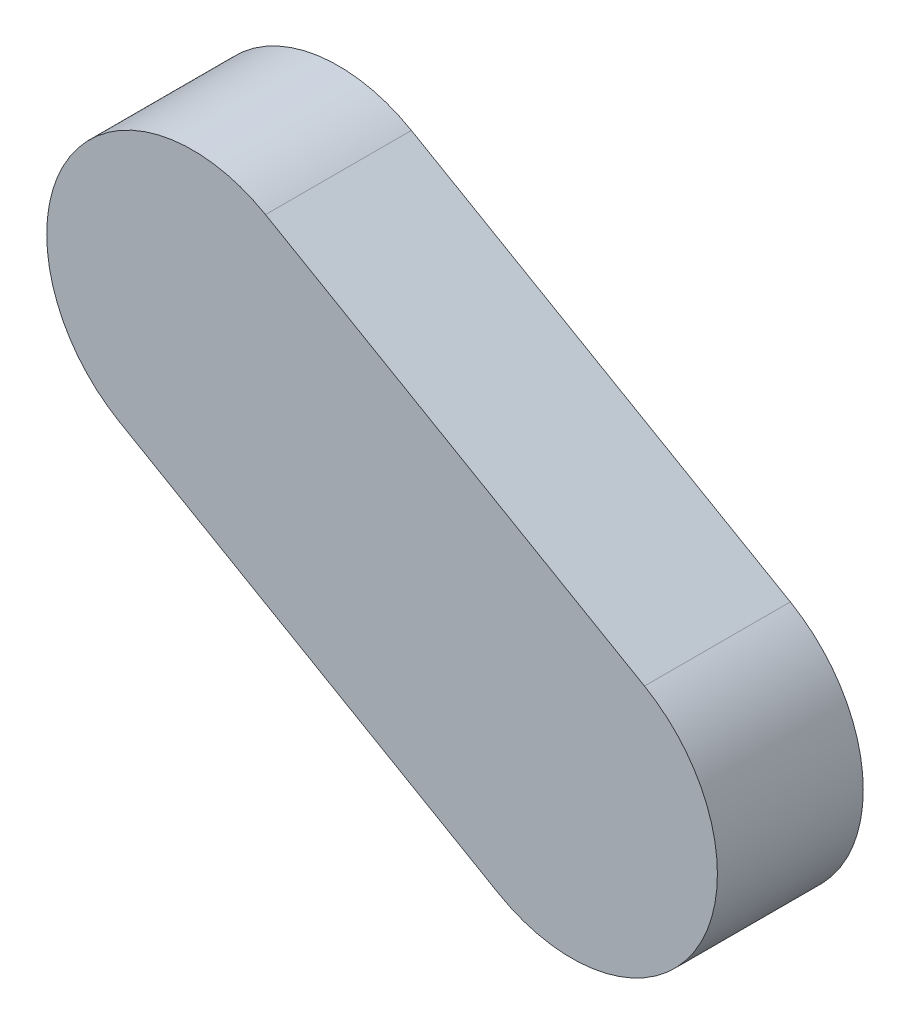
ISO-10303-21;
HEADER;
FILE_DESCRIPTION(('STEP AP214'),'2;1');
FILE_NAME('part.step','',(''),(''),'','','');
FILE_SCHEMA(('AUTOMOTIVE_DESIGN { 1 0 10303 214 1 1 1 1 }'));
ENDSEC;
DATA;
#1=APPLICATION_CONTEXT('core data for automotive mechanical design processes');
#2=APPLICATION_PROTOCOL_DEFINITION('international standard','automotive_design',2000,#1);
#3=PRODUCT_CONTEXT('',#1,'mechanical');
#4=PRODUCT('Part','Part','',(#3));
#5=PRODUCT_RELATED_PRODUCT_CATEGORY('part','',(#4));
#6=PRODUCT_DEFINITION_FORMATION('','',#4);
#7=PRODUCT_DEFINITION_CONTEXT('part definition',#1,'design');
#8=PRODUCT_DEFINITION('design','',#6,#7);
#9=PRODUCT_DEFINITION_SHAPE('','',#8);
#10=(LENGTH_UNIT() NAMED_UNIT(*) SI_UNIT(.MILLI.,.METRE.));
#11=(NAMED_UNIT(*) PLANE_ANGLE_UNIT() SI_UNIT($,.RADIAN.));
#12=(NAMED_UNIT(*) SI_UNIT($,.STERADIAN.) SOLID_ANGLE_UNIT());
#13=UNCERTAINTY_MEASURE_WITH_UNIT(LENGTH_MEASURE(1.E-05),#10,'distance_accuracy_value','');
#14=(GEOMETRIC_REPRESENTATION_CONTEXT(3) GLOBAL_UNCERTAINTY_ASSIGNED_CONTEXT((#13)) GLOBAL_UNIT_ASSIGNED_CONTEXT((#10,
#11,#12)) REPRESENTATION_CONTEXT('',''));
#15=CARTESIAN_POINT('',(0.,0.,0.));
#16=DIRECTION('',(0.,0.,1.));
#17=DIRECTION('',(1.,0.,0.));
#18=AXIS2_PLACEMENT_3D('',#15,#16,#17);
#19=CARTESIAN_POINT('',(-25.9807621135332,14.9999999999998,10.));
#20=DIRECTION('',(0.,0.,-1.));
#21=DIRECTION('',(-1.,0.,0.));
#22=AXIS2_PLACEMENT_3D('',#19,#20,#21);
#23=CYLINDRICAL_SURFACE('',#22,10.0000000000002);
#24=CARTESIAN_POINT('',(-25.9807621135332,14.9999999999998,0.));
#25=DIRECTION('',(0.,0.,1.));
#26=DIRECTION('',(1.,0.,0.));
#27=AXIS2_PLACEMENT_3D('',#24,#25,#26);
#28=CIRCLE('',#27,10.0000000000002);
#29=CARTESIAN_POINT('',(-20.9807621135333,23.6602540378443,0.));
#30=VERTEX_POINT('',#29);
#31=CARTESIAN_POINT('',(-30.9807621135334,6.3397459621551,0.));
#32=VERTEX_POINT('',#31);
#33=EDGE_CURVE('E102',#30,#32,#28,.T.);
#34=ORIENTED_EDGE('',*,*,#33,.T.);
#35=DIRECTION('',(0.,0.,-1.));
#36=VECTOR('',#35,1.);
#37=CARTESIAN_POINT('',(-30.9807621135334,6.3397459621551,10.));
#38=LINE('',#37,#36);
#39=CARTESIAN_POINT('',(-30.9807621135334,6.3397459621551,10.));
#40=VERTEX_POINT('',#39);
#41=EDGE_CURVE('E11',#40,#32,#38,.T.);
#42=ORIENTED_EDGE('',*,*,#41,.F.);
#43=CARTESIAN_POINT('',(-25.9807621135332,14.9999999999998,10.));
#44=DIRECTION('',(0.,0.,1.));
#45=DIRECTION('',(1.,0.,0.));
#46=AXIS2_PLACEMENT_3D('',#43,#44,#45);
#47=CIRCLE('',#46,10.0000000000002);
#48=CARTESIAN_POINT('',(-20.9807621135333,23.6602540378443,10.));
#49=VERTEX_POINT('',#48);
#50=EDGE_CURVE('E90',#49,#40,#47,.T.);
#51=ORIENTED_EDGE('',*,*,#50,.F.);
#52=DIRECTION('',(0.,0.,-1.));
#53=VECTOR('',#52,1.);
#54=CARTESIAN_POINT('',(-20.9807621135333,23.6602540378443,10.));
#55=LINE('',#54,#53);
#56=EDGE_CURVE('E98',#49,#30,#55,.T.);
#57=ORIENTED_EDGE('',*,*,#56,.T.);
#58=EDGE_LOOP('',(#34,#42,#51,#57));
#59=FACE_BOUND('',#58,.T.);
#60=ADVANCED_FACE('F39',(#59),#23,.T.);
#61=CARTESIAN_POINT('',(-30.9807621135334,6.3397459621551,10.));
#62=DIRECTION('',(0.499999999999995,0.866025403784442,0.));
#63=DIRECTION('',(-0.866025403784442,0.499999999999995,0.));
#64=AXIS2_PLACEMENT_3D('',#61,#62,#63);
#65=PLANE('',#64);
#66=DIRECTION('',(0.866025403784442,-0.499999999999995,0.));
#67=VECTOR('',#66,1.);
#68=CARTESIAN_POINT('',(-30.9807621135334,6.3397459621551,0.));
#69=LINE('',#68,#67);
#70=CARTESIAN_POINT('',(-5.00000000000004,-8.66025403784458,0.));
#71=VERTEX_POINT('',#70);
#72=EDGE_CURVE('E94',#32,#71,#69,.T.);
#73=ORIENTED_EDGE('',*,*,#72,.T.);
#74=DIRECTION('',(0.,0.,-1.));
#75=VECTOR('',#74,1.);
#76=CARTESIAN_POINT('',(-5.00000000000004,-8.66025403784458,10.));
#77=LINE('',#76,#75);
#78=CARTESIAN_POINT('',(-5.00000000000004,-8.66025403784458,10.));
#79=VERTEX_POINT('',#78);
#80=EDGE_CURVE('E47',#79,#71,#77,.T.);
#81=ORIENTED_EDGE('',*,*,#80,.F.);
#82=DIRECTION('',(0.866025403784442,-0.499999999999995,0.));
#83=VECTOR('',#82,1.);
#84=CARTESIAN_POINT('',(-30.9807621135334,6.3397459621551,10.));
#85=LINE('',#84,#83);
#86=EDGE_CURVE('E85',#40,#79,#85,.T.);
#87=ORIENTED_EDGE('',*,*,#86,.F.);
#88=ORIENTED_EDGE('',*,*,#41,.T.);
#89=EDGE_LOOP('',(#73,#81,#87,#88));
#90=FACE_BOUND('',#89,.T.);
#91=ADVANCED_FACE('F93',(#90),#65,.F.);
#92=CARTESIAN_POINT('',(0.,0.,10.));
#93=DIRECTION('',(0.,0.,-1.));
#94=DIRECTION('',(-1.,0.,0.));
#95=AXIS2_PLACEMENT_3D('',#92,#93,#94);
#96=CYLINDRICAL_SURFACE('',#95,10.0000000000002);
#97=CARTESIAN_POINT('',(0.,0.,0.));
#98=DIRECTION('',(0.,0.,1.));
#99=DIRECTION('',(1.,0.,0.));
#100=AXIS2_PLACEMENT_3D('',#97,#98,#99);
#101=CIRCLE('',#100,10.0000000000002);
#102=CARTESIAN_POINT('',(4.99999999999995,8.66025403784442,0.));
#103=VERTEX_POINT('',#102);
#104=EDGE_CURVE('E72',#71,#103,#101,.T.);
#105=ORIENTED_EDGE('',*,*,#104,.T.);
#106=DIRECTION('',(0.,0.,-1.));
#107=VECTOR('',#106,1.);
#108=CARTESIAN_POINT('',(4.99999999999995,8.66025403784442,10.));
#109=LINE('',#108,#107);
#110=CARTESIAN_POINT('',(4.99999999999995,8.66025403784442,10.));
#111=VERTEX_POINT('',#110);
#112=EDGE_CURVE('E95',#111,#103,#109,.T.);
#113=ORIENTED_EDGE('',*,*,#112,.F.);
#114=CARTESIAN_POINT('',(0.,0.,10.));
#115=DIRECTION('',(0.,0.,1.));
#116=DIRECTION('',(1.,0.,0.));
#117=AXIS2_PLACEMENT_3D('',#114,#115,#116);
#118=CIRCLE('',#117,10.0000000000002);
#119=EDGE_CURVE('E88',#79,#111,#118,.T.);
#120=ORIENTED_EDGE('',*,*,#119,.F.);
#121=ORIENTED_EDGE('',*,*,#80,.T.);
#122=EDGE_LOOP('',(#105,#113,#120,#121));
#123=FACE_BOUND('',#122,.T.);
#124=ADVANCED_FACE('F96',(#123),#96,.T.);
#125=CARTESIAN_POINT('',(-20.9807621135333,23.6602540378443,10.));
#126=DIRECTION('',(-0.499999999999995,-0.866025403784442,0.));
#127=DIRECTION('',(0.866025403784442,-0.499999999999995,0.));
#128=AXIS2_PLACEMENT_3D('',#125,#126,#127);
#129=PLANE('',#128);
#130=DIRECTION('',(-0.866025403784442,0.499999999999995,0.));
#131=VECTOR('',#130,1.);
#132=CARTESIAN_POINT('',(-20.9807621135333,23.6602540378443,0.));
#133=LINE('',#132,#131);
#134=EDGE_CURVE('E78',#103,#30,#133,.T.);
#135=ORIENTED_EDGE('',*,*,#134,.T.);
#136=ORIENTED_EDGE('',*,*,#56,.F.);
#137=DIRECTION('',(-0.866025403784442,0.499999999999995,0.));
#138=VECTOR('',#137,1.);
#139=CARTESIAN_POINT('',(-20.9807621135333,23.6602540378443,10.));
#140=LINE('',#139,#138);
#141=EDGE_CURVE('E55',#111,#49,#140,.T.);
#142=ORIENTED_EDGE('',*,*,#141,.F.);
#143=ORIENTED_EDGE('',*,*,#112,.T.);
#144=EDGE_LOOP('',(#135,#136,#142,#143));
#145=FACE_BOUND('',#144,.T.);
#146=ADVANCED_FACE('F109',(#145),#129,.F.);
#147=CARTESIAN_POINT('',(-25.9807621135332,14.9999999999998,10.));
#148=DIRECTION('',(0.,0.,1.));
#149=DIRECTION('',(1.,0.,0.));
#150=AXIS2_PLACEMENT_3D('',#147,#148,#149);
#151=PLANE('',#150);
#152=ORIENTED_EDGE('',*,*,#50,.T.);
#153=ORIENTED_EDGE('',*,*,#86,.T.);
#154=ORIENTED_EDGE('',*,*,#119,.T.);
#155=ORIENTED_EDGE('',*,*,#141,.T.);
#156=EDGE_LOOP('',(#152,#153,#154,#155));
#157=FACE_BOUND('',#156,.T.);
#158=ADVANCED_FACE('F86',(#157),#151,.T.);
#159=CARTESIAN_POINT('',(-25.9807621135332,14.9999999999998,0.));
#160=DIRECTION('',(0.,0.,1.));
#161=DIRECTION('',(1.,0.,0.));
#162=AXIS2_PLACEMENT_3D('',#159,#160,#161);
#163=PLANE('',#162);
#164=ORIENTED_EDGE('',*,*,#33,.F.);
#165=ORIENTED_EDGE('',*,*,#134,.F.);
#166=ORIENTED_EDGE('',*,*,#104,.F.);
#167=ORIENTED_EDGE('',*,*,#72,.F.);
#168=EDGE_LOOP('',(#164,#165,#166,#167));
#169=FACE_BOUND('',#168,.T.);
#170=ADVANCED_FACE('F112',(#169),#163,.F.);
#171=CLOSED_SHELL('',(#60,#91,#124,#146,#158,#170));
#172=MANIFOLD_SOLID_BREP('B2',#171);
#173=ADVANCED_BREP_SHAPE_REPRESENTATION('',(#18,#172),#14);
#174=SHAPE_DEFINITION_REPRESENTATION(#9,#173);
ENDSEC;
END-ISO-10303-21;
